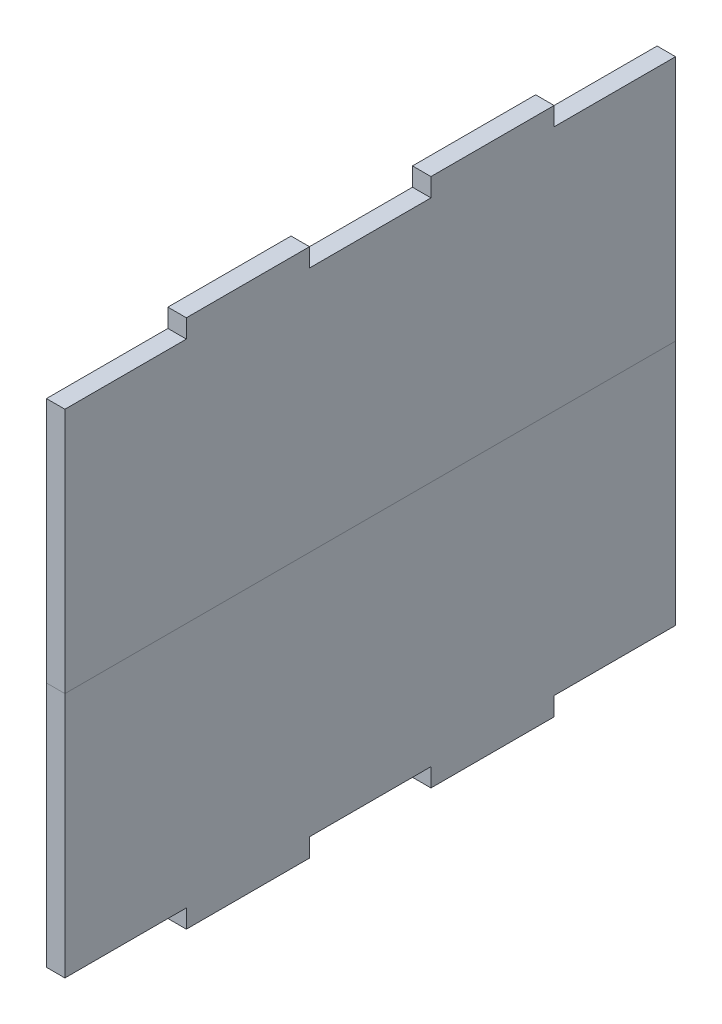
ISO-10303-21;
HEADER;
FILE_DESCRIPTION(('STEP AP214'),'2;1');
FILE_NAME('part.step','',(''),(''),'','','');
FILE_SCHEMA(('AUTOMOTIVE_DESIGN { 1 0 10303 214 1 1 1 1 }'));
ENDSEC;
DATA;
#1=APPLICATION_CONTEXT('core data for automotive mechanical design processes');
#2=APPLICATION_PROTOCOL_DEFINITION('international standard','automotive_design',2000,#1);
#3=PRODUCT_CONTEXT('',#1,'mechanical');
#4=PRODUCT('Part','Part','',(#3));
#5=PRODUCT_RELATED_PRODUCT_CATEGORY('part','',(#4));
#6=PRODUCT_DEFINITION_FORMATION('','',#4);
#7=PRODUCT_DEFINITION_CONTEXT('part definition',#1,'design');
#8=PRODUCT_DEFINITION('design','',#6,#7);
#9=PRODUCT_DEFINITION_SHAPE('','',#8);
#10=(LENGTH_UNIT() NAMED_UNIT(*) SI_UNIT(.MILLI.,.METRE.));
#11=(NAMED_UNIT(*) PLANE_ANGLE_UNIT() SI_UNIT($,.RADIAN.));
#12=(NAMED_UNIT(*) SI_UNIT($,.STERADIAN.) SOLID_ANGLE_UNIT());
#13=UNCERTAINTY_MEASURE_WITH_UNIT(LENGTH_MEASURE(1.E-05),#10,'distance_accuracy_value','');
#14=(GEOMETRIC_REPRESENTATION_CONTEXT(3) GLOBAL_UNCERTAINTY_ASSIGNED_CONTEXT((#13)) GLOBAL_UNIT_ASSIGNED_CONTEXT((#10,
#11,#12)) REPRESENTATION_CONTEXT('',''));
#15=CARTESIAN_POINT('',(0.,0.,0.));
#16=DIRECTION('',(0.,0.,1.));
#17=DIRECTION('',(1.,0.,0.));
#18=AXIS2_PLACEMENT_3D('',#15,#16,#17);
#19=CARTESIAN_POINT('',(3.,0.,0.));
#20=DIRECTION('',(-1.,0.,0.));
#21=DIRECTION('',(0.,1.,0.));
#22=AXIS2_PLACEMENT_3D('',#19,#20,#21);
#23=PLANE('',#22);
#24=DIRECTION('',(0.,-1.,0.));
#25=VECTOR('',#24,1.);
#26=CARTESIAN_POINT('',(3.,0.,99.1766759838869));
#27=LINE('',#26,#25);
#28=CARTESIAN_POINT('',(3.,0.,99.1766759838869));
#29=VERTEX_POINT('',#28);
#30=CARTESIAN_POINT('',(3.,-40.,99.1766759838869));
#31=VERTEX_POINT('',#30);
#32=EDGE_CURVE('E275',#29,#31,#27,.T.);
#33=ORIENTED_EDGE('',*,*,#32,.T.);
#34=DIRECTION('',(0.,0.,-1.));
#35=VECTOR('',#34,1.);
#36=CARTESIAN_POINT('',(3.,-40.,99.1766759838869));
#37=LINE('',#36,#35);
#38=CARTESIAN_POINT('',(3.,-40.,79.4511173225913));
#39=VERTEX_POINT('',#38);
#40=EDGE_CURVE('E285',#31,#39,#37,.T.);
#41=ORIENTED_EDGE('',*,*,#40,.T.);
#42=DIRECTION('',(0.,-1.,0.));
#43=VECTOR('',#42,1.);
#44=CARTESIAN_POINT('',(3.,-40.,79.4511173225913));
#45=LINE('',#44,#43);
#46=CARTESIAN_POINT('',(3.,-43.,79.4511173225913));
#47=VERTEX_POINT('',#46);
#48=EDGE_CURVE('E295',#39,#47,#45,.T.);
#49=ORIENTED_EDGE('',*,*,#48,.T.);
#50=DIRECTION('',(0.,0.,-1.));
#51=VECTOR('',#50,1.);
#52=CARTESIAN_POINT('',(3.,-43.,79.4511173225913));
#53=LINE('',#52,#51);
#54=CARTESIAN_POINT('',(3.,-43.,59.4511173225913));
#55=VERTEX_POINT('',#54);
#56=EDGE_CURVE('E305',#47,#55,#53,.T.);
#57=ORIENTED_EDGE('',*,*,#56,.T.);
#58=DIRECTION('',(0.,1.,0.));
#59=VECTOR('',#58,1.);
#60=CARTESIAN_POINT('',(3.,-43.,59.4511173225913));
#61=LINE('',#60,#59);
#62=CARTESIAN_POINT('',(3.,-40.,59.4511173225913));
#63=VERTEX_POINT('',#62);
#64=EDGE_CURVE('E315',#55,#63,#61,.T.);
#65=ORIENTED_EDGE('',*,*,#64,.T.);
#66=DIRECTION('',(0.,0.,-1.));
#67=VECTOR('',#66,1.);
#68=CARTESIAN_POINT('',(3.,-40.,59.4511173225913));
#69=LINE('',#68,#67);
#70=CARTESIAN_POINT('',(3.,-40.,39.7255586612956));
#71=VERTEX_POINT('',#70);
#72=EDGE_CURVE('E325',#63,#71,#69,.T.);
#73=ORIENTED_EDGE('',*,*,#72,.T.);
#74=DIRECTION('',(0.,-1.,0.));
#75=VECTOR('',#74,1.);
#76=CARTESIAN_POINT('',(3.,-40.,39.7255586612956));
#77=LINE('',#76,#75);
#78=CARTESIAN_POINT('',(3.,-43.,39.7255586612957));
#79=VERTEX_POINT('',#78);
#80=EDGE_CURVE('E335',#71,#79,#77,.T.);
#81=ORIENTED_EDGE('',*,*,#80,.T.);
#82=DIRECTION('',(0.,0.,-1.));
#83=VECTOR('',#82,1.);
#84=CARTESIAN_POINT('',(3.,-43.,39.7255586612957));
#85=LINE('',#84,#83);
#86=CARTESIAN_POINT('',(3.,-43.,19.7255586612956));
#87=VERTEX_POINT('',#86);
#88=EDGE_CURVE('E345',#79,#87,#85,.T.);
#89=ORIENTED_EDGE('',*,*,#88,.T.);
#90=DIRECTION('',(0.,1.,0.));
#91=VECTOR('',#90,1.);
#92=CARTESIAN_POINT('',(3.,-43.,19.7255586612956));
#93=LINE('',#92,#91);
#94=CARTESIAN_POINT('',(3.,-40.,19.7255586612956));
#95=VERTEX_POINT('',#94);
#96=EDGE_CURVE('E355',#87,#95,#93,.T.);
#97=ORIENTED_EDGE('',*,*,#96,.T.);
#98=DIRECTION('',(0.,0.,-1.));
#99=VECTOR('',#98,1.);
#100=CARTESIAN_POINT('',(3.,-40.,19.7255586612956));
#101=LINE('',#100,#99);
#102=CARTESIAN_POINT('',(3.,-40.,0.));
#103=VERTEX_POINT('',#102);
#104=EDGE_CURVE('E365',#95,#103,#101,.T.);
#105=ORIENTED_EDGE('',*,*,#104,.T.);
#106=DIRECTION('',(0.,1.,0.));
#107=VECTOR('',#106,1.);
#108=CARTESIAN_POINT('',(3.,-40.,0.));
#109=LINE('',#108,#107);
#110=CARTESIAN_POINT('',(3.,0.,0.));
#111=VERTEX_POINT('',#110);
#112=EDGE_CURVE('E375',#103,#111,#109,.T.);
#113=ORIENTED_EDGE('',*,*,#112,.T.);
#114=DIRECTION('',(0.,0.,1.));
#115=VECTOR('',#114,1.);
#116=CARTESIAN_POINT('',(3.,0.,0.));
#117=LINE('',#116,#115);
#118=EDGE_CURVE('E10',#111,#29,#117,.T.);
#119=ORIENTED_EDGE('',*,*,#118,.T.);
#120=EDGE_LOOP('',(#33,#41,#49,#57,#65,#73,#81,#89,#97,#105,#113,#119));
#121=FACE_BOUND('',#120,.T.);
#122=ADVANCED_FACE('F16',(#121),#23,.F.);
#123=CARTESIAN_POINT('',(0.,0.,0.));
#124=DIRECTION('',(-1.,0.,0.));
#125=DIRECTION('',(0.,1.,0.));
#126=AXIS2_PLACEMENT_3D('',#123,#124,#125);
#127=PLANE('',#126);
#128=DIRECTION('',(0.,-1.,0.));
#129=VECTOR('',#128,1.);
#130=CARTESIAN_POINT('',(0.,0.,99.1766759838869));
#131=LINE('',#130,#129);
#132=CARTESIAN_POINT('',(0.,0.,99.1766759838869));
#133=VERTEX_POINT('',#132);
#134=CARTESIAN_POINT('',(0.,-40.,99.1766759838869));
#135=VERTEX_POINT('',#134);
#136=EDGE_CURVE('E184',#133,#135,#131,.T.);
#137=ORIENTED_EDGE('',*,*,#136,.F.);
#138=DIRECTION('',(0.,0.,1.));
#139=VECTOR('',#138,1.);
#140=CARTESIAN_POINT('',(0.,0.,0.));
#141=LINE('',#140,#139);
#142=CARTESIAN_POINT('',(0.,0.,0.));
#143=VERTEX_POINT('',#142);
#144=EDGE_CURVE('E23',#143,#133,#141,.T.);
#145=ORIENTED_EDGE('',*,*,#144,.F.);
#146=DIRECTION('',(0.,1.,0.));
#147=VECTOR('',#146,1.);
#148=CARTESIAN_POINT('',(0.,-40.,0.));
#149=LINE('',#148,#147);
#150=CARTESIAN_POINT('',(0.,-40.,0.));
#151=VERTEX_POINT('',#150);
#152=EDGE_CURVE('E371',#151,#143,#149,.T.);
#153=ORIENTED_EDGE('',*,*,#152,.F.);
#154=DIRECTION('',(0.,0.,-1.));
#155=VECTOR('',#154,1.);
#156=CARTESIAN_POINT('',(0.,-40.,19.7255586612956));
#157=LINE('',#156,#155);
#158=CARTESIAN_POINT('',(0.,-40.,19.7255586612956));
#159=VERTEX_POINT('',#158);
#160=EDGE_CURVE('E361',#159,#151,#157,.T.);
#161=ORIENTED_EDGE('',*,*,#160,.F.);
#162=DIRECTION('',(0.,1.,0.));
#163=VECTOR('',#162,1.);
#164=CARTESIAN_POINT('',(0.,-43.,19.7255586612956));
#165=LINE('',#164,#163);
#166=CARTESIAN_POINT('',(0.,-43.,19.7255586612956));
#167=VERTEX_POINT('',#166);
#168=EDGE_CURVE('E351',#167,#159,#165,.T.);
#169=ORIENTED_EDGE('',*,*,#168,.F.);
#170=DIRECTION('',(0.,0.,-1.));
#171=VECTOR('',#170,1.);
#172=CARTESIAN_POINT('',(0.,-43.,39.7255586612957));
#173=LINE('',#172,#171);
#174=CARTESIAN_POINT('',(0.,-43.,39.7255586612957));
#175=VERTEX_POINT('',#174);
#176=EDGE_CURVE('E341',#175,#167,#173,.T.);
#177=ORIENTED_EDGE('',*,*,#176,.F.);
#178=DIRECTION('',(0.,-1.,0.));
#179=VECTOR('',#178,1.);
#180=CARTESIAN_POINT('',(0.,-40.,39.7255586612956));
#181=LINE('',#180,#179);
#182=CARTESIAN_POINT('',(0.,-40.,39.7255586612956));
#183=VERTEX_POINT('',#182);
#184=EDGE_CURVE('E331',#183,#175,#181,.T.);
#185=ORIENTED_EDGE('',*,*,#184,.F.);
#186=DIRECTION('',(0.,0.,-1.));
#187=VECTOR('',#186,1.);
#188=CARTESIAN_POINT('',(0.,-40.,59.4511173225913));
#189=LINE('',#188,#187);
#190=CARTESIAN_POINT('',(0.,-40.,59.4511173225913));
#191=VERTEX_POINT('',#190);
#192=EDGE_CURVE('E321',#191,#183,#189,.T.);
#193=ORIENTED_EDGE('',*,*,#192,.F.);
#194=DIRECTION('',(0.,1.,0.));
#195=VECTOR('',#194,1.);
#196=CARTESIAN_POINT('',(0.,-43.,59.4511173225913));
#197=LINE('',#196,#195);
#198=CARTESIAN_POINT('',(0.,-43.,59.4511173225913));
#199=VERTEX_POINT('',#198);
#200=EDGE_CURVE('E311',#199,#191,#197,.T.);
#201=ORIENTED_EDGE('',*,*,#200,.F.);
#202=DIRECTION('',(0.,0.,-1.));
#203=VECTOR('',#202,1.);
#204=CARTESIAN_POINT('',(0.,-43.,79.4511173225913));
#205=LINE('',#204,#203);
#206=CARTESIAN_POINT('',(0.,-43.,79.4511173225913));
#207=VERTEX_POINT('',#206);
#208=EDGE_CURVE('E301',#207,#199,#205,.T.);
#209=ORIENTED_EDGE('',*,*,#208,.F.);
#210=DIRECTION('',(0.,-1.,0.));
#211=VECTOR('',#210,1.);
#212=CARTESIAN_POINT('',(0.,-40.,79.4511173225913));
#213=LINE('',#212,#211);
#214=CARTESIAN_POINT('',(0.,-40.,79.4511173225913));
#215=VERTEX_POINT('',#214);
#216=EDGE_CURVE('E291',#215,#207,#213,.T.);
#217=ORIENTED_EDGE('',*,*,#216,.F.);
#218=DIRECTION('',(0.,0.,-1.));
#219=VECTOR('',#218,1.);
#220=CARTESIAN_POINT('',(0.,-40.,99.1766759838869));
#221=LINE('',#220,#219);
#222=EDGE_CURVE('E281',#135,#215,#221,.T.);
#223=ORIENTED_EDGE('',*,*,#222,.F.);
#224=EDGE_LOOP('',(#137,#145,#153,#161,#169,#177,#185,#193,#201,#209,#217,#223));
#225=FACE_BOUND('',#224,.T.);
#226=ADVANCED_FACE('F387',(#225),#127,.T.);
#227=CARTESIAN_POINT('',(3.,0.,0.));
#228=DIRECTION('',(0.,1.,0.));
#229=DIRECTION('',(0.,0.,-1.));
#230=AXIS2_PLACEMENT_3D('',#227,#228,#229);
#231=PLANE('',#230);
#232=ORIENTED_EDGE('',*,*,#144,.T.);
#233=DIRECTION('',(-1.,0.,0.));
#234=VECTOR('',#233,1.);
#235=CARTESIAN_POINT('',(3.,0.,99.1766759838869));
#236=LINE('',#235,#234);
#237=EDGE_CURVE('E272',#29,#133,#236,.T.);
#238=ORIENTED_EDGE('',*,*,#237,.F.);
#239=ORIENTED_EDGE('',*,*,#118,.F.);
#240=DIRECTION('',(-1.,0.,0.));
#241=VECTOR('',#240,1.);
#242=CARTESIAN_POINT('',(3.,0.,0.));
#243=LINE('',#242,#241);
#244=EDGE_CURVE('E377',#111,#143,#243,.T.);
#245=ORIENTED_EDGE('',*,*,#244,.T.);
#246=EDGE_LOOP('',(#232,#238,#239,#245));
#247=FACE_BOUND('',#246,.T.);
#248=ADVANCED_FACE('F381',(#247),#231,.T.);
#249=CARTESIAN_POINT('',(3.,-40.,0.));
#250=DIRECTION('',(0.,0.,-1.));
#251=DIRECTION('',(-1.,0.,0.));
#252=AXIS2_PLACEMENT_3D('',#249,#250,#251);
#253=PLANE('',#252);
#254=ORIENTED_EDGE('',*,*,#152,.T.);
#255=ORIENTED_EDGE('',*,*,#244,.F.);
#256=ORIENTED_EDGE('',*,*,#112,.F.);
#257=DIRECTION('',(-1.,0.,0.));
#258=VECTOR('',#257,1.);
#259=CARTESIAN_POINT('',(3.,-40.,0.));
#260=LINE('',#259,#258);
#261=EDGE_CURVE('E368',#103,#151,#260,.T.);
#262=ORIENTED_EDGE('',*,*,#261,.T.);
#263=EDGE_LOOP('',(#254,#255,#256,#262));
#264=FACE_BOUND('',#263,.T.);
#265=ADVANCED_FACE('F394',(#264),#253,.T.);
#266=CARTESIAN_POINT('',(3.,-40.,19.7255586612956));
#267=DIRECTION('',(0.,-1.,0.));
#268=DIRECTION('',(0.,0.,1.));
#269=AXIS2_PLACEMENT_3D('',#266,#267,#268);
#270=PLANE('',#269);
#271=ORIENTED_EDGE('',*,*,#160,.T.);
#272=ORIENTED_EDGE('',*,*,#261,.F.);
#273=ORIENTED_EDGE('',*,*,#104,.F.);
#274=DIRECTION('',(-1.,0.,0.));
#275=VECTOR('',#274,1.);
#276=CARTESIAN_POINT('',(3.,-40.,19.7255586612956));
#277=LINE('',#276,#275);
#278=EDGE_CURVE('E358',#95,#159,#277,.T.);
#279=ORIENTED_EDGE('',*,*,#278,.T.);
#280=EDGE_LOOP('',(#271,#272,#273,#279));
#281=FACE_BOUND('',#280,.T.);
#282=ADVANCED_FACE('F397',(#281),#270,.T.);
#283=CARTESIAN_POINT('',(3.,-43.,19.7255586612956));
#284=DIRECTION('',(0.,0.,-1.));
#285=DIRECTION('',(-1.,0.,0.));
#286=AXIS2_PLACEMENT_3D('',#283,#284,#285);
#287=PLANE('',#286);
#288=ORIENTED_EDGE('',*,*,#168,.T.);
#289=ORIENTED_EDGE('',*,*,#278,.F.);
#290=ORIENTED_EDGE('',*,*,#96,.F.);
#291=DIRECTION('',(-1.,0.,0.));
#292=VECTOR('',#291,1.);
#293=CARTESIAN_POINT('',(3.,-43.,19.7255586612956));
#294=LINE('',#293,#292);
#295=EDGE_CURVE('E348',#87,#167,#294,.T.);
#296=ORIENTED_EDGE('',*,*,#295,.T.);
#297=EDGE_LOOP('',(#288,#289,#290,#296));
#298=FACE_BOUND('',#297,.T.);
#299=ADVANCED_FACE('F399',(#298),#287,.T.);
#300=CARTESIAN_POINT('',(3.,-43.,39.7255586612957));
#301=DIRECTION('',(0.,-1.,0.));
#302=DIRECTION('',(0.,0.,1.));
#303=AXIS2_PLACEMENT_3D('',#300,#301,#302);
#304=PLANE('',#303);
#305=ORIENTED_EDGE('',*,*,#176,.T.);
#306=ORIENTED_EDGE('',*,*,#295,.F.);
#307=ORIENTED_EDGE('',*,*,#88,.F.);
#308=DIRECTION('',(-1.,0.,0.));
#309=VECTOR('',#308,1.);
#310=CARTESIAN_POINT('',(3.,-43.,39.7255586612957));
#311=LINE('',#310,#309);
#312=EDGE_CURVE('E338',#79,#175,#311,.T.);
#313=ORIENTED_EDGE('',*,*,#312,.T.);
#314=EDGE_LOOP('',(#305,#306,#307,#313));
#315=FACE_BOUND('',#314,.T.);
#316=ADVANCED_FACE('F402',(#315),#304,.T.);
#317=CARTESIAN_POINT('',(3.,-40.,39.7255586612956));
#318=DIRECTION('',(0.,0.,1.));
#319=DIRECTION('',(0.,1.,0.));
#320=AXIS2_PLACEMENT_3D('',#317,#318,#319);
#321=PLANE('',#320);
#322=ORIENTED_EDGE('',*,*,#184,.T.);
#323=ORIENTED_EDGE('',*,*,#312,.F.);
#324=ORIENTED_EDGE('',*,*,#80,.F.);
#325=DIRECTION('',(-1.,0.,0.));
#326=VECTOR('',#325,1.);
#327=CARTESIAN_POINT('',(3.,-40.,39.7255586612956));
#328=LINE('',#327,#326);
#329=EDGE_CURVE('E328',#71,#183,#328,.T.);
#330=ORIENTED_EDGE('',*,*,#329,.T.);
#331=EDGE_LOOP('',(#322,#323,#324,#330));
#332=FACE_BOUND('',#331,.T.);
#333=ADVANCED_FACE('F406',(#332),#321,.T.);
#334=CARTESIAN_POINT('',(3.,-40.,59.4511173225913));
#335=DIRECTION('',(0.,-1.,0.));
#336=DIRECTION('',(0.,0.,1.));
#337=AXIS2_PLACEMENT_3D('',#334,#335,#336);
#338=PLANE('',#337);
#339=ORIENTED_EDGE('',*,*,#192,.T.);
#340=ORIENTED_EDGE('',*,*,#329,.F.);
#341=ORIENTED_EDGE('',*,*,#72,.F.);
#342=DIRECTION('',(-1.,0.,0.));
#343=VECTOR('',#342,1.);
#344=CARTESIAN_POINT('',(3.,-40.,59.4511173225913));
#345=LINE('',#344,#343);
#346=EDGE_CURVE('E318',#63,#191,#345,.T.);
#347=ORIENTED_EDGE('',*,*,#346,.T.);
#348=EDGE_LOOP('',(#339,#340,#341,#347));
#349=FACE_BOUND('',#348,.T.);
#350=ADVANCED_FACE('F408',(#349),#338,.T.);
#351=CARTESIAN_POINT('',(3.,-43.,59.4511173225913));
#352=DIRECTION('',(0.,0.,-1.));
#353=DIRECTION('',(-1.,0.,0.));
#354=AXIS2_PLACEMENT_3D('',#351,#352,#353);
#355=PLANE('',#354);
#356=ORIENTED_EDGE('',*,*,#200,.T.);
#357=ORIENTED_EDGE('',*,*,#346,.F.);
#358=ORIENTED_EDGE('',*,*,#64,.F.);
#359=DIRECTION('',(-1.,0.,0.));
#360=VECTOR('',#359,1.);
#361=CARTESIAN_POINT('',(3.,-43.,59.4511173225913));
#362=LINE('',#361,#360);
#363=EDGE_CURVE('E308',#55,#199,#362,.T.);
#364=ORIENTED_EDGE('',*,*,#363,.T.);
#365=EDGE_LOOP('',(#356,#357,#358,#364));
#366=FACE_BOUND('',#365,.T.);
#367=ADVANCED_FACE('F411',(#366),#355,.T.);
#368=CARTESIAN_POINT('',(3.,-43.,79.4511173225913));
#369=DIRECTION('',(0.,-1.,0.));
#370=DIRECTION('',(0.,0.,1.));
#371=AXIS2_PLACEMENT_3D('',#368,#369,#370);
#372=PLANE('',#371);
#373=ORIENTED_EDGE('',*,*,#208,.T.);
#374=ORIENTED_EDGE('',*,*,#363,.F.);
#375=ORIENTED_EDGE('',*,*,#56,.F.);
#376=DIRECTION('',(-1.,0.,0.));
#377=VECTOR('',#376,1.);
#378=CARTESIAN_POINT('',(3.,-43.,79.4511173225913));
#379=LINE('',#378,#377);
#380=EDGE_CURVE('E298',#47,#207,#379,.T.);
#381=ORIENTED_EDGE('',*,*,#380,.T.);
#382=EDGE_LOOP('',(#373,#374,#375,#381));
#383=FACE_BOUND('',#382,.T.);
#384=ADVANCED_FACE('F415',(#383),#372,.T.);
#385=CARTESIAN_POINT('',(3.,-40.,79.4511173225913));
#386=DIRECTION('',(0.,0.,1.));
#387=DIRECTION('',(1.,0.,0.));
#388=AXIS2_PLACEMENT_3D('',#385,#386,#387);
#389=PLANE('',#388);
#390=ORIENTED_EDGE('',*,*,#216,.T.);
#391=ORIENTED_EDGE('',*,*,#380,.F.);
#392=ORIENTED_EDGE('',*,*,#48,.F.);
#393=DIRECTION('',(-1.,0.,0.));
#394=VECTOR('',#393,1.);
#395=CARTESIAN_POINT('',(3.,-40.,79.4511173225913));
#396=LINE('',#395,#394);
#397=EDGE_CURVE('E288',#39,#215,#396,.T.);
#398=ORIENTED_EDGE('',*,*,#397,.T.);
#399=EDGE_LOOP('',(#390,#391,#392,#398));
#400=FACE_BOUND('',#399,.T.);
#401=ADVANCED_FACE('F417',(#400),#389,.T.);
#402=CARTESIAN_POINT('',(3.,-40.,99.1766759838869));
#403=DIRECTION('',(0.,-1.,0.));
#404=DIRECTION('',(0.,0.,1.));
#405=AXIS2_PLACEMENT_3D('',#402,#403,#404);
#406=PLANE('',#405);
#407=ORIENTED_EDGE('',*,*,#222,.T.);
#408=ORIENTED_EDGE('',*,*,#397,.F.);
#409=ORIENTED_EDGE('',*,*,#40,.F.);
#410=DIRECTION('',(-1.,0.,0.));
#411=VECTOR('',#410,1.);
#412=CARTESIAN_POINT('',(3.,-40.,99.1766759838869));
#413=LINE('',#412,#411);
#414=EDGE_CURVE('E278',#31,#135,#413,.T.);
#415=ORIENTED_EDGE('',*,*,#414,.T.);
#416=EDGE_LOOP('',(#407,#408,#409,#415));
#417=FACE_BOUND('',#416,.T.);
#418=ADVANCED_FACE('F390',(#417),#406,.T.);
#419=CARTESIAN_POINT('',(3.,0.,99.1766759838869));
#420=DIRECTION('',(0.,0.,1.));
#421=DIRECTION('',(1.,0.,0.));
#422=AXIS2_PLACEMENT_3D('',#419,#420,#421);
#423=PLANE('',#422);
#424=ORIENTED_EDGE('',*,*,#136,.T.);
#425=ORIENTED_EDGE('',*,*,#414,.F.);
#426=ORIENTED_EDGE('',*,*,#32,.F.);
#427=ORIENTED_EDGE('',*,*,#237,.T.);
#428=EDGE_LOOP('',(#424,#425,#426,#427));
#429=FACE_BOUND('',#428,.T.);
#430=ADVANCED_FACE('F385',(#429),#423,.T.);
#431=CLOSED_SHELL('',(#122,#226,#248,#265,#282,#299,#316,#333,#350,#367,#384,#401,#418,#430));
#432=MANIFOLD_SOLID_BREP('B1',#431);
#433=CARTESIAN_POINT('',(3.,0.,99.1766759838869));
#434=DIRECTION('',(0.,0.,1.));
#435=DIRECTION('',(1.,0.,0.));
#436=AXIS2_PLACEMENT_3D('',#433,#434,#435);
#437=PLANE('',#436);
#438=DIRECTION('',(0.,1.,0.));
#439=VECTOR('',#438,1.);
#440=CARTESIAN_POINT('',(0.,0.,99.1766759838869));
#441=LINE('',#440,#439);
#442=CARTESIAN_POINT('',(0.,0.,99.1766759838869));
#443=VERTEX_POINT('',#442);
#444=CARTESIAN_POINT('',(0.,40.,99.1766759838869));
#445=VERTEX_POINT('',#444);
#446=EDGE_CURVE('E212',#443,#445,#441,.T.);
#447=ORIENTED_EDGE('',*,*,#446,.F.);
#448=DIRECTION('',(-1.,0.,0.));
#449=VECTOR('',#448,1.);
#450=CARTESIAN_POINT('',(3.,0.,99.1766759838869));
#451=LINE('',#450,#449);
#452=CARTESIAN_POINT('',(3.,0.,99.1766759838869));
#453=VERTEX_POINT('',#452);
#454=EDGE_CURVE('E197',#453,#443,#451,.T.);
#455=ORIENTED_EDGE('',*,*,#454,.F.);
#456=DIRECTION('',(0.,1.,0.));
#457=VECTOR('',#456,1.);
#458=CARTESIAN_POINT('',(3.,0.,99.1766759838869));
#459=LINE('',#458,#457);
#460=CARTESIAN_POINT('',(3.,40.,99.1766759838869));
#461=VERTEX_POINT('',#460);
#462=EDGE_CURVE('E191',#453,#461,#459,.T.);
#463=ORIENTED_EDGE('',*,*,#462,.T.);
#464=DIRECTION('',(-1.,0.,0.));
#465=VECTOR('',#464,1.);
#466=CARTESIAN_POINT('',(3.,40.,99.1766759838869));
#467=LINE('',#466,#465);
#468=EDGE_CURVE('E173',#461,#445,#467,.T.);
#469=ORIENTED_EDGE('',*,*,#468,.T.);
#470=EDGE_LOOP('',(#447,#455,#463,#469));
#471=FACE_BOUND('',#470,.T.);
#472=ADVANCED_FACE('F196',(#471),#437,.T.);
#473=CARTESIAN_POINT('',(3.,40.,99.1766759838869));
#474=DIRECTION('',(0.,1.,0.));
#475=DIRECTION('',(0.,0.,1.));
#476=AXIS2_PLACEMENT_3D('',#473,#474,#475);
#477=PLANE('',#476);
#478=DIRECTION('',(0.,0.,-1.));
#479=VECTOR('',#478,1.);
#480=CARTESIAN_POINT('',(0.,40.,99.1766759838869));
#481=LINE('',#480,#479);
#482=CARTESIAN_POINT('',(0.,40.,79.4511173225913));
#483=VERTEX_POINT('',#482);
#484=EDGE_CURVE('E179',#445,#483,#481,.T.);
#485=ORIENTED_EDGE('',*,*,#484,.F.);
#486=ORIENTED_EDGE('',*,*,#468,.F.);
#487=DIRECTION('',(0.,0.,-1.));
#488=VECTOR('',#487,1.);
#489=CARTESIAN_POINT('',(3.,40.,99.1766759838869));
#490=LINE('',#489,#488);
#491=CARTESIAN_POINT('',(3.,40.,79.4511173225913));
#492=VERTEX_POINT('',#491);
#493=EDGE_CURVE('E176',#461,#492,#490,.T.);
#494=ORIENTED_EDGE('',*,*,#493,.T.);
#495=DIRECTION('',(-1.,0.,0.));
#496=VECTOR('',#495,1.);
#497=CARTESIAN_POINT('',(3.,40.,79.4511173225913));
#498=LINE('',#497,#496);
#499=EDGE_CURVE('E185',#492,#483,#498,.T.);
#500=ORIENTED_EDGE('',*,*,#499,.T.);
#501=EDGE_LOOP('',(#485,#486,#494,#500));
#502=FACE_BOUND('',#501,.T.);
#503=ADVANCED_FACE('F175',(#502),#477,.T.);
#504=CARTESIAN_POINT('',(3.,40.,79.4511173225913));
#505=DIRECTION('',(0.,0.,1.));
#506=DIRECTION('',(1.,0.,0.));
#507=AXIS2_PLACEMENT_3D('',#504,#505,#506);
#508=PLANE('',#507);
#509=DIRECTION('',(0.,1.,0.));
#510=VECTOR('',#509,1.);
#511=CARTESIAN_POINT('',(0.,40.,79.4511173225913));
#512=LINE('',#511,#510);
#513=CARTESIAN_POINT('',(0.,43.,79.4511173225913));
#514=VERTEX_POINT('',#513);
#515=EDGE_CURVE('E211',#483,#514,#512,.T.);
#516=ORIENTED_EDGE('',*,*,#515,.F.);
#517=ORIENTED_EDGE('',*,*,#499,.F.);
#518=DIRECTION('',(0.,1.,0.));
#519=VECTOR('',#518,1.);
#520=CARTESIAN_POINT('',(3.,40.,79.4511173225913));
#521=LINE('',#520,#519);
#522=CARTESIAN_POINT('',(3.,43.,79.4511173225913));
#523=VERTEX_POINT('',#522);
#524=EDGE_CURVE('E194',#492,#523,#521,.T.);
#525=ORIENTED_EDGE('',*,*,#524,.T.);
#526=DIRECTION('',(-1.,0.,0.));
#527=VECTOR('',#526,1.);
#528=CARTESIAN_POINT('',(3.,43.,79.4511173225913));
#529=LINE('',#528,#527);
#530=EDGE_CURVE('E266',#523,#514,#529,.T.);
#531=ORIENTED_EDGE('',*,*,#530,.T.);
#532=EDGE_LOOP('',(#516,#517,#525,#531));
#533=FACE_BOUND('',#532,.T.);
#534=ADVANCED_FACE('F504',(#533),#508,.T.);
#535=CARTESIAN_POINT('',(3.,43.,79.4511173225913));
#536=DIRECTION('',(0.,1.,0.));
#537=DIRECTION('',(0.,0.,1.));
#538=AXIS2_PLACEMENT_3D('',#535,#536,#537);
#539=PLANE('',#538);
#540=DIRECTION('',(0.,0.,-1.));
#541=VECTOR('',#540,1.);
#542=CARTESIAN_POINT('',(0.,43.,79.4511173225913));
#543=LINE('',#542,#541);
#544=CARTESIAN_POINT('',(0.,43.,59.4511173225913));
#545=VERTEX_POINT('',#544);
#546=EDGE_CURVE('E216',#514,#545,#543,.T.);
#547=ORIENTED_EDGE('',*,*,#546,.F.);
#548=ORIENTED_EDGE('',*,*,#530,.F.);
#549=DIRECTION('',(0.,0.,-1.));
#550=VECTOR('',#549,1.);
#551=CARTESIAN_POINT('',(3.,43.,79.4511173225913));
#552=LINE('',#551,#550);
#553=CARTESIAN_POINT('',(3.,43.,59.4511173225913));
#554=VERTEX_POINT('',#553);
#555=EDGE_CURVE('E872',#523,#554,#552,.T.);
#556=ORIENTED_EDGE('',*,*,#555,.T.);
#557=DIRECTION('',(-1.,0.,0.));
#558=VECTOR('',#557,1.);
#559=CARTESIAN_POINT('',(3.,43.,59.4511173225913));
#560=LINE('',#559,#558);
#561=EDGE_CURVE('E264',#554,#545,#560,.T.);
#562=ORIENTED_EDGE('',*,*,#561,.T.);
#563=EDGE_LOOP('',(#547,#548,#556,#562));
#564=FACE_BOUND('',#563,.T.);
#565=ADVANCED_FACE('F514',(#564),#539,.T.);
#566=CARTESIAN_POINT('',(3.,43.,59.4511173225913));
#567=DIRECTION('',(0.,0.,-1.));
#568=DIRECTION('',(-1.,0.,0.));
#569=AXIS2_PLACEMENT_3D('',#566,#567,#568);
#570=PLANE('',#569);
#571=DIRECTION('',(0.,-1.,0.));
#572=VECTOR('',#571,1.);
#573=CARTESIAN_POINT('',(0.,43.,59.4511173225913));
#574=LINE('',#573,#572);
#575=CARTESIAN_POINT('',(0.,40.,59.4511173225913));
#576=VERTEX_POINT('',#575);
#577=EDGE_CURVE('E220',#545,#576,#574,.T.);
#578=ORIENTED_EDGE('',*,*,#577,.F.);
#579=ORIENTED_EDGE('',*,*,#561,.F.);
#580=DIRECTION('',(0.,-1.,0.));
#581=VECTOR('',#580,1.);
#582=CARTESIAN_POINT('',(3.,43.,59.4511173225913));
#583=LINE('',#582,#581);
#584=CARTESIAN_POINT('',(3.,40.,59.4511173225913));
#585=VERTEX_POINT('',#584);
#586=EDGE_CURVE('E869',#554,#585,#583,.T.);
#587=ORIENTED_EDGE('',*,*,#586,.T.);
#588=DIRECTION('',(-1.,0.,0.));
#589=VECTOR('',#588,1.);
#590=CARTESIAN_POINT('',(3.,40.,59.4511173225913));
#591=LINE('',#590,#589);
#592=EDGE_CURVE('E262',#585,#576,#591,.T.);
#593=ORIENTED_EDGE('',*,*,#592,.T.);
#594=EDGE_LOOP('',(#578,#579,#587,#593));
#595=FACE_BOUND('',#594,.T.);
#596=ADVANCED_FACE('F525',(#595),#570,.T.);
#597=CARTESIAN_POINT('',(3.,40.,59.4511173225913));
#598=DIRECTION('',(0.,1.,0.));
#599=DIRECTION('',(0.,0.,1.));
#600=AXIS2_PLACEMENT_3D('',#597,#598,#599);
#601=PLANE('',#600);
#602=DIRECTION('',(0.,0.,-1.));
#603=VECTOR('',#602,1.);
#604=CARTESIAN_POINT('',(0.,40.,59.4511173225913));
#605=LINE('',#604,#603);
#606=CARTESIAN_POINT('',(0.,40.,39.7255586612956));
#607=VERTEX_POINT('',#606);
#608=EDGE_CURVE('E224',#576,#607,#605,.T.);
#609=ORIENTED_EDGE('',*,*,#608,.F.);
#610=ORIENTED_EDGE('',*,*,#592,.F.);
#611=DIRECTION('',(0.,0.,-1.));
#612=VECTOR('',#611,1.);
#613=CARTESIAN_POINT('',(3.,40.,59.4511173225913));
#614=LINE('',#613,#612);
#615=CARTESIAN_POINT('',(3.,40.,39.7255586612956));
#616=VERTEX_POINT('',#615);
#617=EDGE_CURVE('E866',#585,#616,#614,.T.);
#618=ORIENTED_EDGE('',*,*,#617,.T.);
#619=DIRECTION('',(-1.,0.,0.));
#620=VECTOR('',#619,1.);
#621=CARTESIAN_POINT('',(3.,40.,39.7255586612956));
#622=LINE('',#621,#620);
#623=EDGE_CURVE('E260',#616,#607,#622,.T.);
#624=ORIENTED_EDGE('',*,*,#623,.T.);
#625=EDGE_LOOP('',(#609,#610,#618,#624));
#626=FACE_BOUND('',#625,.T.);
#627=ADVANCED_FACE('F536',(#626),#601,.T.);
#628=CARTESIAN_POINT('',(3.,40.,39.7255586612956));
#629=DIRECTION('',(0.,0.,1.));
#630=DIRECTION('',(0.,-1.,0.));
#631=AXIS2_PLACEMENT_3D('',#628,#629,#630);
#632=PLANE('',#631);
#633=DIRECTION('',(0.,1.,0.));
#634=VECTOR('',#633,1.);
#635=CARTESIAN_POINT('',(0.,40.,39.7255586612956));
#636=LINE('',#635,#634);
#637=CARTESIAN_POINT('',(0.,43.,39.7255586612957));
#638=VERTEX_POINT('',#637);
#639=EDGE_CURVE('E228',#607,#638,#636,.T.);
#640=ORIENTED_EDGE('',*,*,#639,.F.);
#641=ORIENTED_EDGE('',*,*,#623,.F.);
#642=DIRECTION('',(0.,1.,0.));
#643=VECTOR('',#642,1.);
#644=CARTESIAN_POINT('',(3.,40.,39.7255586612956));
#645=LINE('',#644,#643);
#646=CARTESIAN_POINT('',(3.,43.,39.7255586612957));
#647=VERTEX_POINT('',#646);
#648=EDGE_CURVE('E863',#616,#647,#645,.T.);
#649=ORIENTED_EDGE('',*,*,#648,.T.);
#650=DIRECTION('',(-1.,0.,0.));
#651=VECTOR('',#650,1.);
#652=CARTESIAN_POINT('',(3.,43.,39.7255586612957));
#653=LINE('',#652,#651);
#654=EDGE_CURVE('E258',#647,#638,#653,.T.);
#655=ORIENTED_EDGE('',*,*,#654,.T.);
#656=EDGE_LOOP('',(#640,#641,#649,#655));
#657=FACE_BOUND('',#656,.T.);
#658=ADVANCED_FACE('F547',(#657),#632,.T.);
#659=CARTESIAN_POINT('',(3.,43.,39.7255586612957));
#660=DIRECTION('',(0.,1.,0.));
#661=DIRECTION('',(0.,0.,1.));
#662=AXIS2_PLACEMENT_3D('',#659,#660,#661);
#663=PLANE('',#662);
#664=DIRECTION('',(0.,0.,-1.));
#665=VECTOR('',#664,1.);
#666=CARTESIAN_POINT('',(0.,43.,39.7255586612957));
#667=LINE('',#666,#665);
#668=CARTESIAN_POINT('',(0.,43.,19.7255586612956));
#669=VERTEX_POINT('',#668);
#670=EDGE_CURVE('E232',#638,#669,#667,.T.);
#671=ORIENTED_EDGE('',*,*,#670,.F.);
#672=ORIENTED_EDGE('',*,*,#654,.F.);
#673=DIRECTION('',(0.,0.,-1.));
#674=VECTOR('',#673,1.);
#675=CARTESIAN_POINT('',(3.,43.,39.7255586612957));
#676=LINE('',#675,#674);
#677=CARTESIAN_POINT('',(3.,43.,19.7255586612956));
#678=VERTEX_POINT('',#677);
#679=EDGE_CURVE('E860',#647,#678,#676,.T.);
#680=ORIENTED_EDGE('',*,*,#679,.T.);
#681=DIRECTION('',(-1.,0.,0.));
#682=VECTOR('',#681,1.);
#683=CARTESIAN_POINT('',(3.,43.,19.7255586612956));
#684=LINE('',#683,#682);
#685=EDGE_CURVE('E256',#678,#669,#684,.T.);
#686=ORIENTED_EDGE('',*,*,#685,.T.);
#687=EDGE_LOOP('',(#671,#672,#680,#686));
#688=FACE_BOUND('',#687,.T.);
#689=ADVANCED_FACE('F558',(#688),#663,.T.);
#690=CARTESIAN_POINT('',(3.,43.,19.7255586612956));
#691=DIRECTION('',(0.,0.,-1.));
#692=DIRECTION('',(-1.,0.,0.));
#693=AXIS2_PLACEMENT_3D('',#690,#691,#692);
#694=PLANE('',#693);
#695=DIRECTION('',(0.,-1.,0.));
#696=VECTOR('',#695,1.);
#697=CARTESIAN_POINT('',(0.,43.,19.7255586612956));
#698=LINE('',#697,#696);
#699=CARTESIAN_POINT('',(0.,40.,19.7255586612956));
#700=VERTEX_POINT('',#699);
#701=EDGE_CURVE('E236',#669,#700,#698,.T.);
#702=ORIENTED_EDGE('',*,*,#701,.F.);
#703=ORIENTED_EDGE('',*,*,#685,.F.);
#704=DIRECTION('',(0.,-1.,0.));
#705=VECTOR('',#704,1.);
#706=CARTESIAN_POINT('',(3.,43.,19.7255586612956));
#707=LINE('',#706,#705);
#708=CARTESIAN_POINT('',(3.,40.,19.7255586612956));
#709=VERTEX_POINT('',#708);
#710=EDGE_CURVE('E855',#678,#709,#707,.T.);
#711=ORIENTED_EDGE('',*,*,#710,.T.);
#712=DIRECTION('',(-1.,0.,0.));
#713=VECTOR('',#712,1.);
#714=CARTESIAN_POINT('',(3.,40.,19.7255586612956));
#715=LINE('',#714,#713);
#716=EDGE_CURVE('E254',#709,#700,#715,.T.);
#717=ORIENTED_EDGE('',*,*,#716,.T.);
#718=EDGE_LOOP('',(#702,#703,#711,#717));
#719=FACE_BOUND('',#718,.T.);
#720=ADVANCED_FACE('F569',(#719),#694,.T.);
#721=CARTESIAN_POINT('',(3.,40.,19.7255586612956));
#722=DIRECTION('',(0.,1.,0.));
#723=DIRECTION('',(0.,0.,1.));
#724=AXIS2_PLACEMENT_3D('',#721,#722,#723);
#725=PLANE('',#724);
#726=DIRECTION('',(0.,0.,-1.));
#727=VECTOR('',#726,1.);
#728=CARTESIAN_POINT('',(0.,40.,19.7255586612956));
#729=LINE('',#728,#727);
#730=CARTESIAN_POINT('',(0.,40.,0.));
#731=VERTEX_POINT('',#730);
#732=EDGE_CURVE('E240',#700,#731,#729,.T.);
#733=ORIENTED_EDGE('',*,*,#732,.F.);
#734=ORIENTED_EDGE('',*,*,#716,.F.);
#735=DIRECTION('',(0.,0.,-1.));
#736=VECTOR('',#735,1.);
#737=CARTESIAN_POINT('',(3.,40.,19.7255586612956));
#738=LINE('',#737,#736);
#739=CARTESIAN_POINT('',(3.,40.,0.));
#740=VERTEX_POINT('',#739);
#741=EDGE_CURVE('E853',#709,#740,#738,.T.);
#742=ORIENTED_EDGE('',*,*,#741,.T.);
#743=DIRECTION('',(-1.,0.,0.));
#744=VECTOR('',#743,1.);
#745=CARTESIAN_POINT('',(3.,40.,0.));
#746=LINE('',#745,#744);
#747=EDGE_CURVE('E252',#740,#731,#746,.T.);
#748=ORIENTED_EDGE('',*,*,#747,.T.);
#749=EDGE_LOOP('',(#733,#734,#742,#748));
#750=FACE_BOUND('',#749,.T.);
#751=ADVANCED_FACE('F580',(#750),#725,.T.);
#752=CARTESIAN_POINT('',(3.,40.,0.));
#753=DIRECTION('',(0.,0.,-1.));
#754=DIRECTION('',(-1.,0.,0.));
#755=AXIS2_PLACEMENT_3D('',#752,#753,#754);
#756=PLANE('',#755);
#757=DIRECTION('',(0.,-1.,0.));
#758=VECTOR('',#757,1.);
#759=CARTESIAN_POINT('',(0.,40.,0.));
#760=LINE('',#759,#758);
#761=CARTESIAN_POINT('',(0.,0.,0.));
#762=VERTEX_POINT('',#761);
#763=EDGE_CURVE('E203',#731,#762,#760,.T.);
#764=ORIENTED_EDGE('',*,*,#763,.F.);
#765=ORIENTED_EDGE('',*,*,#747,.F.);
#766=DIRECTION('',(0.,-1.,0.));
#767=VECTOR('',#766,1.);
#768=CARTESIAN_POINT('',(3.,40.,0.));
#769=LINE('',#768,#767);
#770=CARTESIAN_POINT('',(3.,0.,0.));
#771=VERTEX_POINT('',#770);
#772=EDGE_CURVE('E852',#740,#771,#769,.T.);
#773=ORIENTED_EDGE('',*,*,#772,.T.);
#774=DIRECTION('',(-1.,0.,0.));
#775=VECTOR('',#774,1.);
#776=CARTESIAN_POINT('',(3.,0.,0.));
#777=LINE('',#776,#775);
#778=EDGE_CURVE('E250',#771,#762,#777,.T.);
#779=ORIENTED_EDGE('',*,*,#778,.T.);
#780=EDGE_LOOP('',(#764,#765,#773,#779));
#781=FACE_BOUND('',#780,.T.);
#782=ADVANCED_FACE('F591',(#781),#756,.T.);
#783=CARTESIAN_POINT('',(3.,0.,0.));
#784=DIRECTION('',(0.,-1.,0.));
#785=DIRECTION('',(0.,0.,-1.));
#786=AXIS2_PLACEMENT_3D('',#783,#784,#785);
#787=PLANE('',#786);
#788=DIRECTION('',(0.,0.,1.));
#789=VECTOR('',#788,1.);
#790=CARTESIAN_POINT('',(0.,0.,0.));
#791=LINE('',#790,#789);
#792=EDGE_CURVE('E199',#762,#443,#791,.T.);
#793=ORIENTED_EDGE('',*,*,#792,.F.);
#794=ORIENTED_EDGE('',*,*,#778,.F.);
#795=DIRECTION('',(0.,0.,1.));
#796=VECTOR('',#795,1.);
#797=CARTESIAN_POINT('',(3.,0.,0.));
#798=LINE('',#797,#796);
#799=EDGE_CURVE('E207',#771,#453,#798,.T.);
#800=ORIENTED_EDGE('',*,*,#799,.T.);
#801=ORIENTED_EDGE('',*,*,#454,.T.);
#802=EDGE_LOOP('',(#793,#794,#800,#801));
#803=FACE_BOUND('',#802,.T.);
#804=ADVANCED_FACE('F602',(#803),#787,.T.);
#805=CARTESIAN_POINT('',(3.,0.,0.));
#806=DIRECTION('',(-1.,0.,0.));
#807=DIRECTION('',(0.,-1.,0.));
#808=AXIS2_PLACEMENT_3D('',#805,#806,#807);
#809=PLANE('',#808);
#810=ORIENTED_EDGE('',*,*,#462,.F.);
#811=ORIENTED_EDGE('',*,*,#799,.F.);
#812=ORIENTED_EDGE('',*,*,#772,.F.);
#813=ORIENTED_EDGE('',*,*,#741,.F.);
#814=ORIENTED_EDGE('',*,*,#710,.F.);
#815=ORIENTED_EDGE('',*,*,#679,.F.);
#816=ORIENTED_EDGE('',*,*,#648,.F.);
#817=ORIENTED_EDGE('',*,*,#617,.F.);
#818=ORIENTED_EDGE('',*,*,#586,.F.);
#819=ORIENTED_EDGE('',*,*,#555,.F.);
#820=ORIENTED_EDGE('',*,*,#524,.F.);
#821=ORIENTED_EDGE('',*,*,#493,.F.);
#822=EDGE_LOOP('',(#810,#811,#812,#813,#814,#815,#816,#817,#818,#819,#820,#821));
#823=FACE_BOUND('',#822,.T.);
#824=ADVANCED_FACE('F189',(#823),#809,.F.);
#825=CARTESIAN_POINT('',(0.,0.,0.));
#826=DIRECTION('',(-1.,0.,0.));
#827=DIRECTION('',(0.,-1.,0.));
#828=AXIS2_PLACEMENT_3D('',#825,#826,#827);
#829=PLANE('',#828);
#830=ORIENTED_EDGE('',*,*,#446,.T.);
#831=ORIENTED_EDGE('',*,*,#484,.T.);
#832=ORIENTED_EDGE('',*,*,#515,.T.);
#833=ORIENTED_EDGE('',*,*,#546,.T.);
#834=ORIENTED_EDGE('',*,*,#577,.T.);
#835=ORIENTED_EDGE('',*,*,#608,.T.);
#836=ORIENTED_EDGE('',*,*,#639,.T.);
#837=ORIENTED_EDGE('',*,*,#670,.T.);
#838=ORIENTED_EDGE('',*,*,#701,.T.);
#839=ORIENTED_EDGE('',*,*,#732,.T.);
#840=ORIENTED_EDGE('',*,*,#763,.T.);
#841=ORIENTED_EDGE('',*,*,#792,.T.);
#842=EDGE_LOOP('',(#830,#831,#832,#833,#834,#835,#836,#837,#838,#839,#840,#841));
#843=FACE_BOUND('',#842,.T.);
#844=ADVANCED_FACE('F623',(#843),#829,.T.);
#845=CLOSED_SHELL('',(#472,#503,#534,#565,#596,#627,#658,#689,#720,#751,#782,#804,#824,#844));
#846=MANIFOLD_SOLID_BREP('B1',#845);
#847=ADVANCED_BREP_SHAPE_REPRESENTATION('',(#18,#432,#846),#14);
#848=SHAPE_DEFINITION_REPRESENTATION(#9,#847);
ENDSEC;
END-ISO-10303-21;
